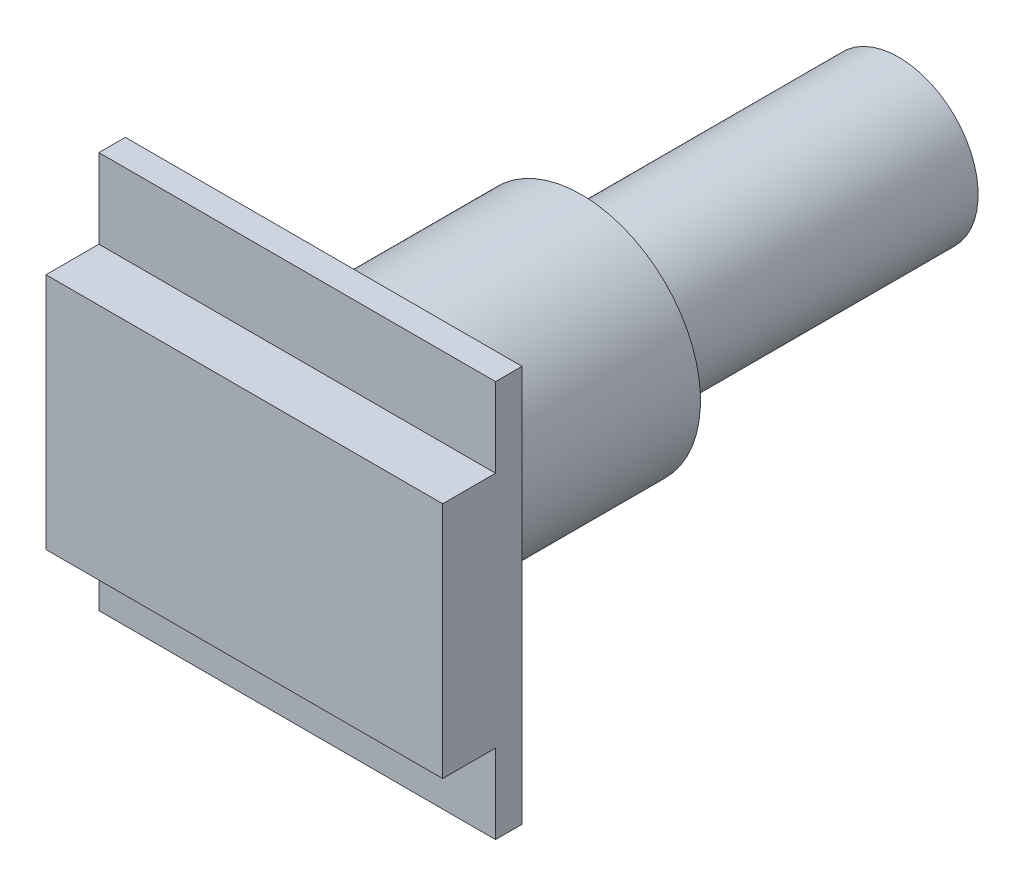
ISO-10303-21;
HEADER;
FILE_DESCRIPTION(('STEP AP214'),'2;1');
FILE_NAME('part.step','',(''),(''),'','','');
FILE_SCHEMA(('AUTOMOTIVE_DESIGN { 1 0 10303 214 1 1 1 1 }'));
ENDSEC;
DATA;
#1=APPLICATION_CONTEXT('core data for automotive mechanical design processes');
#2=APPLICATION_PROTOCOL_DEFINITION('international standard','automotive_design',2000,#1);
#3=PRODUCT_CONTEXT('',#1,'mechanical');
#4=PRODUCT('Part','Part','',(#3));
#5=PRODUCT_RELATED_PRODUCT_CATEGORY('part','',(#4));
#6=PRODUCT_DEFINITION_FORMATION('','',#4);
#7=PRODUCT_DEFINITION_CONTEXT('part definition',#1,'design');
#8=PRODUCT_DEFINITION('design','',#6,#7);
#9=PRODUCT_DEFINITION_SHAPE('','',#8);
#10=(LENGTH_UNIT() NAMED_UNIT(*) SI_UNIT(.MILLI.,.METRE.));
#11=(NAMED_UNIT(*) PLANE_ANGLE_UNIT() SI_UNIT($,.RADIAN.));
#12=(NAMED_UNIT(*) SI_UNIT($,.STERADIAN.) SOLID_ANGLE_UNIT());
#13=UNCERTAINTY_MEASURE_WITH_UNIT(LENGTH_MEASURE(1.E-05),#10,'distance_accuracy_value','');
#14=(GEOMETRIC_REPRESENTATION_CONTEXT(3) GLOBAL_UNCERTAINTY_ASSIGNED_CONTEXT((#13)) GLOBAL_UNIT_ASSIGNED_CONTEXT((#10,
#11,#12)) REPRESENTATION_CONTEXT('',''));
#15=CARTESIAN_POINT('',(0.,0.,0.));
#16=DIRECTION('',(0.,0.,1.));
#17=DIRECTION('',(1.,0.,0.));
#18=AXIS2_PLACEMENT_3D('',#15,#16,#17);
#19=CARTESIAN_POINT('',(-39.1932110682111,23.6904761904762,6.));
#20=DIRECTION('',(1.,0.,0.));
#21=DIRECTION('',(0.,0.,-1.));
#22=AXIS2_PLACEMENT_3D('',#19,#20,#21);
#23=PLANE('',#22);
#24=DIRECTION('',(0.,-1.,0.));
#25=VECTOR('',#24,1.);
#26=CARTESIAN_POINT('',(-39.1932110682111,23.6904761904762,6.));
#27=LINE('',#26,#25);
#28=CARTESIAN_POINT('',(-39.1932110682111,17.6904761904762,6.));
#29=VERTEX_POINT('',#28);
#30=CARTESIAN_POINT('',(-39.1932110682111,-0.30952380952382,6.));
#31=VERTEX_POINT('',#30);
#32=EDGE_CURVE('E143',#29,#31,#27,.T.);
#33=ORIENTED_EDGE('',*,*,#32,.F.);
#34=DIRECTION('',(0.,0.,1.));
#35=VECTOR('',#34,1.);
#36=CARTESIAN_POINT('',(-39.1932110682111,17.6904761904762,2.));
#37=LINE('',#36,#35);
#38=CARTESIAN_POINT('',(-39.1932110682111,17.6904761904762,2.));
#39=VERTEX_POINT('',#38);
#40=EDGE_CURVE('E58',#39,#29,#37,.T.);
#41=ORIENTED_EDGE('',*,*,#40,.F.);
#42=DIRECTION('',(0.,-1.,0.));
#43=VECTOR('',#42,1.);
#44=CARTESIAN_POINT('',(-39.1932110682111,23.6904761904762,2.));
#45=LINE('',#44,#43);
#46=CARTESIAN_POINT('',(-39.1932110682111,23.6904761904762,2.));
#47=VERTEX_POINT('',#46);
#48=EDGE_CURVE('E113',#47,#39,#45,.T.);
#49=ORIENTED_EDGE('',*,*,#48,.F.);
#50=DIRECTION('',(0.,0.,-1.));
#51=VECTOR('',#50,1.);
#52=CARTESIAN_POINT('',(-39.1932110682111,23.6904761904762,6.));
#53=LINE('',#52,#51);
#54=CARTESIAN_POINT('',(-39.1932110682111,23.6904761904762,0.));
#55=VERTEX_POINT('',#54);
#56=EDGE_CURVE('E125',#47,#55,#53,.T.);
#57=ORIENTED_EDGE('',*,*,#56,.T.);
#58=DIRECTION('',(0.,-1.,0.));
#59=VECTOR('',#58,1.);
#60=CARTESIAN_POINT('',(-39.1932110682111,23.6904761904762,0.));
#61=LINE('',#60,#59);
#62=CARTESIAN_POINT('',(-39.1932110682111,-6.30952380952382,0.));
#63=VERTEX_POINT('',#62);
#64=EDGE_CURVE('E199',#55,#63,#61,.T.);
#65=ORIENTED_EDGE('',*,*,#64,.T.);
#66=DIRECTION('',(0.,0.,-1.));
#67=VECTOR('',#66,1.);
#68=CARTESIAN_POINT('',(-39.1932110682111,-6.30952380952382,6.));
#69=LINE('',#68,#67);
#70=CARTESIAN_POINT('',(-39.1932110682111,-6.30952380952382,2.));
#71=VERTEX_POINT('',#70);
#72=EDGE_CURVE('E44',#71,#63,#69,.T.);
#73=ORIENTED_EDGE('',*,*,#72,.F.);
#74=DIRECTION('',(0.,-1.,0.));
#75=VECTOR('',#74,1.);
#76=CARTESIAN_POINT('',(-39.1932110682111,-6.30952380952382,2.));
#77=LINE('',#76,#75);
#78=CARTESIAN_POINT('',(-39.1932110682111,-0.30952380952382,2.));
#79=VERTEX_POINT('',#78);
#80=EDGE_CURVE('E190',#79,#71,#77,.T.);
#81=ORIENTED_EDGE('',*,*,#80,.F.);
#82=DIRECTION('',(0.,0.,1.));
#83=VECTOR('',#82,1.);
#84=CARTESIAN_POINT('',(-39.1932110682111,-0.30952380952382,2.));
#85=LINE('',#84,#83);
#86=EDGE_CURVE('E195',#79,#31,#85,.T.);
#87=ORIENTED_EDGE('',*,*,#86,.T.);
#88=EDGE_LOOP('',(#33,#41,#49,#57,#65,#73,#81,#87));
#89=FACE_BOUND('',#88,.T.);
#90=ADVANCED_FACE('F41',(#89),#23,.F.);
#91=CARTESIAN_POINT('',(-39.1932110682111,-6.30952380952382,6.));
#92=DIRECTION('',(0.,1.,0.));
#93=DIRECTION('',(0.,0.,1.));
#94=AXIS2_PLACEMENT_3D('',#91,#92,#93);
#95=PLANE('',#94);
#96=DIRECTION('',(0.,0.,-1.));
#97=VECTOR('',#96,1.);
#98=CARTESIAN_POINT('',(-9.19321106821106,-6.30952380952382,6.));
#99=LINE('',#98,#97);
#100=CARTESIAN_POINT('',(-9.19321106821106,-6.30952380952382,2.));
#101=VERTEX_POINT('',#100);
#102=CARTESIAN_POINT('',(-9.19321106821106,-6.30952380952382,0.));
#103=VERTEX_POINT('',#102);
#104=EDGE_CURVE('E140',#101,#103,#99,.T.);
#105=ORIENTED_EDGE('',*,*,#104,.F.);
#106=DIRECTION('',(1.,0.,0.));
#107=VECTOR('',#106,1.);
#108=CARTESIAN_POINT('',(-9.19321106821106,-6.30952380952382,2.));
#109=LINE('',#108,#107);
#110=EDGE_CURVE('E179',#71,#101,#109,.T.);
#111=ORIENTED_EDGE('',*,*,#110,.F.);
#112=ORIENTED_EDGE('',*,*,#72,.T.);
#113=DIRECTION('',(1.,0.,0.));
#114=VECTOR('',#113,1.);
#115=CARTESIAN_POINT('',(-39.1932110682111,-6.30952380952382,0.));
#116=LINE('',#115,#114);
#117=EDGE_CURVE('E206',#63,#103,#116,.T.);
#118=ORIENTED_EDGE('',*,*,#117,.T.);
#119=EDGE_LOOP('',(#105,#111,#112,#118));
#120=FACE_BOUND('',#119,.T.);
#121=ADVANCED_FACE('F218',(#120),#95,.F.);
#122=CARTESIAN_POINT('',(-9.19321106821107,23.6904761904762,6.));
#123=DIRECTION('',(-1.,0.,0.));
#124=DIRECTION('',(0.,-1.,0.));
#125=AXIS2_PLACEMENT_3D('',#122,#123,#124);
#126=PLANE('',#125);
#127=DIRECTION('',(0.,1.,0.));
#128=VECTOR('',#127,1.);
#129=CARTESIAN_POINT('',(-9.19321106821107,23.6904761904762,2.));
#130=LINE('',#129,#128);
#131=CARTESIAN_POINT('',(-9.19321106821107,17.6904761904762,2.));
#132=VERTEX_POINT('',#131);
#133=CARTESIAN_POINT('',(-9.19321106821107,23.6904761904762,2.));
#134=VERTEX_POINT('',#133);
#135=EDGE_CURVE('E115',#132,#134,#130,.T.);
#136=ORIENTED_EDGE('',*,*,#135,.F.);
#137=DIRECTION('',(0.,0.,1.));
#138=VECTOR('',#137,1.);
#139=CARTESIAN_POINT('',(-9.19321106821107,17.6904761904762,2.));
#140=LINE('',#139,#138);
#141=CARTESIAN_POINT('',(-9.19321106821107,17.6904761904762,6.));
#142=VERTEX_POINT('',#141);
#143=EDGE_CURVE('E172',#132,#142,#140,.T.);
#144=ORIENTED_EDGE('',*,*,#143,.T.);
#145=DIRECTION('',(0.,1.,0.));
#146=VECTOR('',#145,1.);
#147=CARTESIAN_POINT('',(-9.19321106821107,23.6904761904762,6.));
#148=LINE('',#147,#146);
#149=CARTESIAN_POINT('',(-9.19321106821106,-0.309523809523822,6.));
#150=VERTEX_POINT('',#149);
#151=EDGE_CURVE('E136',#150,#142,#148,.T.);
#152=ORIENTED_EDGE('',*,*,#151,.F.);
#153=DIRECTION('',(0.,0.,1.));
#154=VECTOR('',#153,1.);
#155=CARTESIAN_POINT('',(-9.19321106821106,-0.30952380952382,2.));
#156=LINE('',#155,#154);
#157=CARTESIAN_POINT('',(-9.19321106821106,-0.30952380952382,2.));
#158=VERTEX_POINT('',#157);
#159=EDGE_CURVE('E66',#158,#150,#156,.T.);
#160=ORIENTED_EDGE('',*,*,#159,.F.);
#161=DIRECTION('',(0.,1.,0.));
#162=VECTOR('',#161,1.);
#163=CARTESIAN_POINT('',(-9.19321106821106,-0.30952380952382,2.));
#164=LINE('',#163,#162);
#165=EDGE_CURVE('E182',#101,#158,#164,.T.);
#166=ORIENTED_EDGE('',*,*,#165,.F.);
#167=ORIENTED_EDGE('',*,*,#104,.T.);
#168=DIRECTION('',(0.,1.,0.));
#169=VECTOR('',#168,1.);
#170=CARTESIAN_POINT('',(-9.19321106821107,23.6904761904762,0.));
#171=LINE('',#170,#169);
#172=CARTESIAN_POINT('',(-9.19321106821107,23.6904761904762,0.));
#173=VERTEX_POINT('',#172);
#174=EDGE_CURVE('E208',#103,#173,#171,.T.);
#175=ORIENTED_EDGE('',*,*,#174,.T.);
#176=DIRECTION('',(0.,0.,-1.));
#177=VECTOR('',#176,1.);
#178=CARTESIAN_POINT('',(-9.19321106821107,23.6904761904762,6.));
#179=LINE('',#178,#177);
#180=EDGE_CURVE('E135',#134,#173,#179,.T.);
#181=ORIENTED_EDGE('',*,*,#180,.F.);
#182=EDGE_LOOP('',(#136,#144,#152,#160,#166,#167,#175,#181));
#183=FACE_BOUND('',#182,.T.);
#184=ADVANCED_FACE('F212',(#183),#126,.F.);
#185=CARTESIAN_POINT('',(-39.1932110682111,23.6904761904762,6.));
#186=DIRECTION('',(0.,-1.,0.));
#187=DIRECTION('',(0.,0.,-1.));
#188=AXIS2_PLACEMENT_3D('',#185,#186,#187);
#189=PLANE('',#188);
#190=ORIENTED_EDGE('',*,*,#56,.F.);
#191=DIRECTION('',(-1.,0.,0.));
#192=VECTOR('',#191,1.);
#193=CARTESIAN_POINT('',(-39.1932110682111,23.6904761904762,2.));
#194=LINE('',#193,#192);
#195=EDGE_CURVE('E109',#134,#47,#194,.T.);
#196=ORIENTED_EDGE('',*,*,#195,.F.);
#197=ORIENTED_EDGE('',*,*,#180,.T.);
#198=DIRECTION('',(-1.,0.,0.));
#199=VECTOR('',#198,1.);
#200=CARTESIAN_POINT('',(-39.1932110682111,23.6904761904762,0.));
#201=LINE('',#200,#199);
#202=EDGE_CURVE('E132',#173,#55,#201,.T.);
#203=ORIENTED_EDGE('',*,*,#202,.T.);
#204=EDGE_LOOP('',(#190,#196,#197,#203));
#205=FACE_BOUND('',#204,.T.);
#206=ADVANCED_FACE('F130',(#205),#189,.F.);
#207=CARTESIAN_POINT('',(0.,0.,6.));
#208=DIRECTION('',(0.,0.,1.));
#209=DIRECTION('',(1.,0.,0.));
#210=AXIS2_PLACEMENT_3D('',#207,#208,#209);
#211=PLANE('',#210);
#212=DIRECTION('',(1.,0.,0.));
#213=VECTOR('',#212,1.);
#214=CARTESIAN_POINT('',(-9.19321106821107,17.6904761904762,6.));
#215=LINE('',#214,#213);
#216=EDGE_CURVE('E120',#29,#142,#215,.T.);
#217=ORIENTED_EDGE('',*,*,#216,.F.);
#218=ORIENTED_EDGE('',*,*,#32,.T.);
#219=DIRECTION('',(-1.,0.,0.));
#220=VECTOR('',#219,1.);
#221=CARTESIAN_POINT('',(-39.1932110682111,-0.30952380952382,6.));
#222=LINE('',#221,#220);
#223=EDGE_CURVE('E176',#150,#31,#222,.T.);
#224=ORIENTED_EDGE('',*,*,#223,.F.);
#225=ORIENTED_EDGE('',*,*,#151,.T.);
#226=EDGE_LOOP('',(#217,#218,#224,#225));
#227=FACE_BOUND('',#226,.T.);
#228=ADVANCED_FACE('F228',(#227),#211,.T.);
#229=CARTESIAN_POINT('',(0.,0.,0.));
#230=DIRECTION('',(0.,0.,1.));
#231=DIRECTION('',(1.,0.,0.));
#232=AXIS2_PLACEMENT_3D('',#229,#230,#231);
#233=PLANE('',#232);
#234=CARTESIAN_POINT('',(-24.1932110682111,8.69047619047618,0.));
#235=DIRECTION('',(0.,0.,-1.));
#236=DIRECTION('',(-1.,0.,0.));
#237=AXIS2_PLACEMENT_3D('',#234,#235,#236);
#238=CIRCLE('',#237,9.00000000000001);
#239=CARTESIAN_POINT('',(-33.1932110682111,8.69047619047618,0.));
#240=VERTEX_POINT('',#239);
#241=EDGE_CURVE('E50',#240,#240,#238,.T.);
#242=ORIENTED_EDGE('',*,*,#241,.F.);
#243=EDGE_LOOP('',(#242));
#244=FACE_BOUND('',#243,.T.);
#245=ORIENTED_EDGE('',*,*,#64,.F.);
#246=ORIENTED_EDGE('',*,*,#202,.F.);
#247=ORIENTED_EDGE('',*,*,#174,.F.);
#248=ORIENTED_EDGE('',*,*,#117,.F.);
#249=EDGE_LOOP('',(#245,#246,#247,#248));
#250=FACE_BOUND('',#249,.T.);
#251=ADVANCED_FACE('F214',(#244,#250),#233,.F.);
#252=CARTESIAN_POINT('',(-39.1932110682111,-0.30952380952382,2.));
#253=DIRECTION('',(0.,1.,0.));
#254=DIRECTION('',(0.,0.,1.));
#255=AXIS2_PLACEMENT_3D('',#252,#253,#254);
#256=PLANE('',#255);
#257=ORIENTED_EDGE('',*,*,#223,.T.);
#258=ORIENTED_EDGE('',*,*,#86,.F.);
#259=DIRECTION('',(-1.,0.,0.));
#260=VECTOR('',#259,1.);
#261=CARTESIAN_POINT('',(-39.1932110682111,-0.30952380952382,2.));
#262=LINE('',#261,#260);
#263=EDGE_CURVE('E186',#158,#79,#262,.T.);
#264=ORIENTED_EDGE('',*,*,#263,.F.);
#265=ORIENTED_EDGE('',*,*,#159,.T.);
#266=EDGE_LOOP('',(#257,#258,#264,#265));
#267=FACE_BOUND('',#266,.T.);
#268=ADVANCED_FACE('F231',(#267),#256,.F.);
#269=CARTESIAN_POINT('',(0.,0.,2.));
#270=DIRECTION('',(0.,0.,-1.));
#271=DIRECTION('',(-1.,0.,0.));
#272=AXIS2_PLACEMENT_3D('',#269,#270,#271);
#273=PLANE('',#272);
#274=ORIENTED_EDGE('',*,*,#110,.T.);
#275=ORIENTED_EDGE('',*,*,#165,.T.);
#276=ORIENTED_EDGE('',*,*,#263,.T.);
#277=ORIENTED_EDGE('',*,*,#80,.T.);
#278=EDGE_LOOP('',(#274,#275,#276,#277));
#279=FACE_BOUND('',#278,.T.);
#280=ADVANCED_FACE('F217',(#279),#273,.F.);
#281=CARTESIAN_POINT('',(-9.19321106821107,17.6904761904762,2.));
#282=DIRECTION('',(0.,-1.,0.));
#283=DIRECTION('',(0.,0.,-1.));
#284=AXIS2_PLACEMENT_3D('',#281,#282,#283);
#285=PLANE('',#284);
#286=ORIENTED_EDGE('',*,*,#216,.T.);
#287=ORIENTED_EDGE('',*,*,#143,.F.);
#288=DIRECTION('',(1.,0.,0.));
#289=VECTOR('',#288,1.);
#290=CARTESIAN_POINT('',(-9.19321106821107,17.6904761904762,2.));
#291=LINE('',#290,#289);
#292=EDGE_CURVE('E128',#39,#132,#291,.T.);
#293=ORIENTED_EDGE('',*,*,#292,.F.);
#294=ORIENTED_EDGE('',*,*,#40,.T.);
#295=EDGE_LOOP('',(#286,#287,#293,#294));
#296=FACE_BOUND('',#295,.T.);
#297=ADVANCED_FACE('F240',(#296),#285,.F.);
#298=CARTESIAN_POINT('',(0.,0.,2.));
#299=DIRECTION('',(0.,0.,-1.));
#300=DIRECTION('',(-1.,0.,0.));
#301=AXIS2_PLACEMENT_3D('',#298,#299,#300);
#302=PLANE('',#301);
#303=ORIENTED_EDGE('',*,*,#195,.T.);
#304=ORIENTED_EDGE('',*,*,#48,.T.);
#305=ORIENTED_EDGE('',*,*,#292,.T.);
#306=ORIENTED_EDGE('',*,*,#135,.T.);
#307=EDGE_LOOP('',(#303,#304,#305,#306));
#308=FACE_BOUND('',#307,.T.);
#309=ADVANCED_FACE('F111',(#308),#302,.F.);
#310=CARTESIAN_POINT('',(-24.1932110682111,8.69047619047618,-19.5));
#311=DIRECTION('',(0.,0.,1.));
#312=DIRECTION('',(1.,0.,0.));
#313=AXIS2_PLACEMENT_3D('',#310,#311,#312);
#314=CYLINDRICAL_SURFACE('',#313,9.00000000000001);
#315=CARTESIAN_POINT('',(-24.1932110682111,8.69047619047618,-19.5));
#316=DIRECTION('',(0.,0.,-1.));
#317=DIRECTION('',(-1.,0.,0.));
#318=AXIS2_PLACEMENT_3D('',#315,#316,#317);
#319=CIRCLE('',#318,9.00000000000001);
#320=CARTESIAN_POINT('',(-33.1932110682111,8.69047619047618,-19.5));
#321=VERTEX_POINT('',#320);
#322=EDGE_CURVE('E164',#321,#321,#319,.T.);
#323=ORIENTED_EDGE('',*,*,#322,.F.);
#324=EDGE_LOOP('',(#323));
#325=FACE_BOUND('',#324,.T.);
#326=ORIENTED_EDGE('',*,*,#241,.T.);
#327=EDGE_LOOP('',(#326));
#328=FACE_BOUND('',#327,.T.);
#329=ADVANCED_FACE('F245',(#325,#328),#314,.T.);
#330=CARTESIAN_POINT('',(-24.1932110682111,8.69047619047618,-19.5));
#331=DIRECTION('',(0.,0.,-1.));
#332=DIRECTION('',(-1.,0.,0.));
#333=AXIS2_PLACEMENT_3D('',#330,#331,#332);
#334=PLANE('',#333);
#335=CARTESIAN_POINT('',(-24.1932110682111,8.69047619047618,-19.5));
#336=DIRECTION('',(0.,0.,-1.));
#337=DIRECTION('',(-1.,0.,0.));
#338=AXIS2_PLACEMENT_3D('',#335,#336,#337);
#339=CIRCLE('',#338,6.);
#340=CARTESIAN_POINT('',(-30.1932110682111,8.69047619047618,-19.5));
#341=VERTEX_POINT('',#340);
#342=EDGE_CURVE('E11',#341,#341,#339,.T.);
#343=ORIENTED_EDGE('',*,*,#342,.F.);
#344=EDGE_LOOP('',(#343));
#345=FACE_BOUND('',#344,.T.);
#346=ORIENTED_EDGE('',*,*,#322,.T.);
#347=EDGE_LOOP('',(#346));
#348=FACE_BOUND('',#347,.T.);
#349=ADVANCED_FACE('F248',(#345,#348),#334,.T.);
#350=CARTESIAN_POINT('',(-24.1932110682111,8.69047619047618,-43.5));
#351=DIRECTION('',(0.,0.,1.));
#352=DIRECTION('',(1.,0.,0.));
#353=AXIS2_PLACEMENT_3D('',#350,#351,#352);
#354=CYLINDRICAL_SURFACE('',#353,6.);
#355=CARTESIAN_POINT('',(-24.1932110682111,8.69047619047618,-43.5));
#356=DIRECTION('',(0.,0.,-1.));
#357=DIRECTION('',(-1.,0.,0.));
#358=AXIS2_PLACEMENT_3D('',#355,#356,#357);
#359=CIRCLE('',#358,6.);
#360=CARTESIAN_POINT('',(-30.1932110682111,8.69047619047618,-43.5));
#361=VERTEX_POINT('',#360);
#362=EDGE_CURVE('E264',#361,#361,#359,.T.);
#363=ORIENTED_EDGE('',*,*,#362,.F.);
#364=EDGE_LOOP('',(#363));
#365=FACE_BOUND('',#364,.T.);
#366=ORIENTED_EDGE('',*,*,#342,.T.);
#367=EDGE_LOOP('',(#366));
#368=FACE_BOUND('',#367,.T.);
#369=ADVANCED_FACE('F252',(#365,#368),#354,.T.);
#370=CARTESIAN_POINT('',(-24.1932110682111,8.69047619047618,-43.5));
#371=DIRECTION('',(0.,0.,-1.));
#372=DIRECTION('',(-1.,0.,0.));
#373=AXIS2_PLACEMENT_3D('',#370,#371,#372);
#374=PLANE('',#373);
#375=ORIENTED_EDGE('',*,*,#362,.T.);
#376=EDGE_LOOP('',(#375));
#377=FACE_BOUND('',#376,.T.);
#378=ADVANCED_FACE('F256',(#377),#374,.T.);
#379=CLOSED_SHELL('',(#90,#121,#184,#206,#228,#251,#268,#280,#297,#309,#329,#349,#369,#378));
#380=MANIFOLD_SOLID_BREP('B2',#379);
#381=ADVANCED_BREP_SHAPE_REPRESENTATION('',(#18,#380),#14);
#382=SHAPE_DEFINITION_REPRESENTATION(#9,#381);
ENDSEC;
END-ISO-10303-21;
